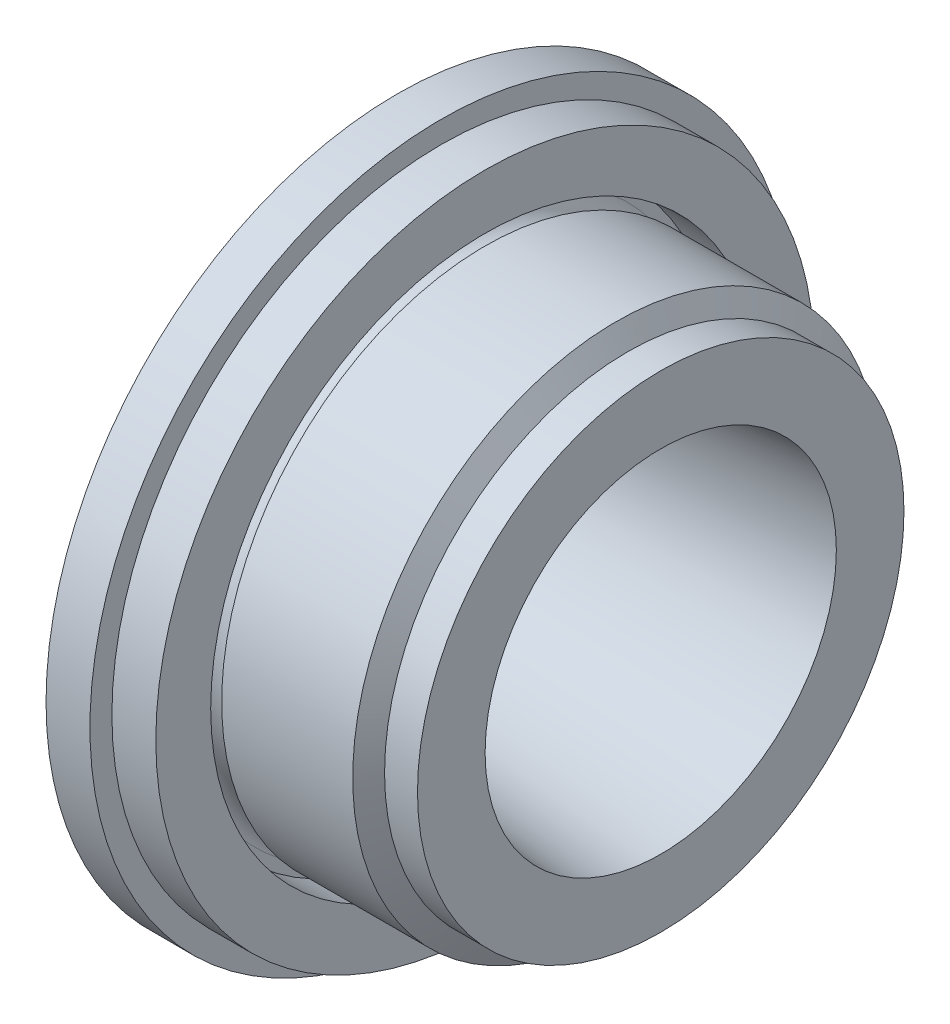
ISO-10303-21;
HEADER;
FILE_DESCRIPTION(('STEP AP214'),'2;1');
FILE_NAME('part.step','',(''),(''),'','','');
FILE_SCHEMA(('AUTOMOTIVE_DESIGN { 1 0 10303 214 1 1 1 1 }'));
ENDSEC;
DATA;
#1=APPLICATION_CONTEXT('core data for automotive mechanical design processes');
#2=APPLICATION_PROTOCOL_DEFINITION('international standard','automotive_design',2000,#1);
#3=PRODUCT_CONTEXT('',#1,'mechanical');
#4=PRODUCT('Part','Part','',(#3));
#5=PRODUCT_RELATED_PRODUCT_CATEGORY('part','',(#4));
#6=PRODUCT_DEFINITION_FORMATION('','',#4);
#7=PRODUCT_DEFINITION_CONTEXT('part definition',#1,'design');
#8=PRODUCT_DEFINITION('design','',#6,#7);
#9=PRODUCT_DEFINITION_SHAPE('','',#8);
#10=(LENGTH_UNIT() NAMED_UNIT(*) SI_UNIT(.MILLI.,.METRE.));
#11=(NAMED_UNIT(*) PLANE_ANGLE_UNIT() SI_UNIT($,.RADIAN.));
#12=(NAMED_UNIT(*) SI_UNIT($,.STERADIAN.) SOLID_ANGLE_UNIT());
#13=UNCERTAINTY_MEASURE_WITH_UNIT(LENGTH_MEASURE(1.E-05),#10,'distance_accuracy_value','');
#14=(GEOMETRIC_REPRESENTATION_CONTEXT(3) GLOBAL_UNCERTAINTY_ASSIGNED_CONTEXT((#13)) GLOBAL_UNIT_ASSIGNED_CONTEXT((#10,
#11,#12)) REPRESENTATION_CONTEXT('',''));
#15=CARTESIAN_POINT('',(0.,0.,0.));
#16=DIRECTION('',(0.,0.,1.));
#17=DIRECTION('',(1.,0.,0.));
#18=AXIS2_PLACEMENT_3D('',#15,#16,#17);
#19=CARTESIAN_POINT('',(6.,0.,-15.));
#20=DIRECTION('',(1.,0.,0.));
#21=DIRECTION('',(0.,0.,-1.));
#22=AXIS2_PLACEMENT_3D('',#19,#20,#21);
#23=PLANE('',#22);
#24=CARTESIAN_POINT('',(6.,0.,0.));
#25=DIRECTION('',(-1.,0.,0.));
#26=DIRECTION('',(0.,0.,1.));
#27=AXIS2_PLACEMENT_3D('',#24,#25,#26);
#28=CIRCLE('',#27,12.5);
#29=CARTESIAN_POINT('',(6.,0.,12.5));
#30=VERTEX_POINT('',#29);
#31=EDGE_CURVE('E11',#30,#30,#28,.T.);
#32=ORIENTED_EDGE('',*,*,#31,.F.);
#33=EDGE_LOOP('',(#32));
#34=FACE_BOUND('',#33,.T.);
#35=CARTESIAN_POINT('',(6.,0.,0.));
#36=DIRECTION('',(-1.,0.,0.));
#37=DIRECTION('',(0.,0.,1.));
#38=AXIS2_PLACEMENT_3D('',#35,#36,#37);
#39=CIRCLE('',#38,15.);
#40=CARTESIAN_POINT('',(6.,0.,15.));
#41=VERTEX_POINT('',#40);
#42=EDGE_CURVE('E48',#41,#41,#39,.T.);
#43=ORIENTED_EDGE('',*,*,#42,.T.);
#44=EDGE_LOOP('',(#43));
#45=FACE_BOUND('',#44,.T.);
#46=ADVANCED_FACE('F34',(#34,#45),#23,.F.);
#47=CARTESIAN_POINT('',(0.,0.,0.));
#48=DIRECTION('',(-1.,0.,0.));
#49=DIRECTION('',(0.,0.,1.));
#50=AXIS2_PLACEMENT_3D('',#47,#48,#49);
#51=CYLINDRICAL_SURFACE('',#50,12.5);
#52=CARTESIAN_POINT('',(8.,0.,0.));
#53=DIRECTION('',(-1.,0.,0.));
#54=DIRECTION('',(0.,0.,1.));
#55=AXIS2_PLACEMENT_3D('',#52,#53,#54);
#56=CIRCLE('',#55,12.5);
#57=CARTESIAN_POINT('',(8.,0.,12.5));
#58=VERTEX_POINT('',#57);
#59=EDGE_CURVE('E40',#58,#58,#56,.T.);
#60=ORIENTED_EDGE('',*,*,#59,.F.);
#61=EDGE_LOOP('',(#60));
#62=FACE_BOUND('',#61,.T.);
#63=ORIENTED_EDGE('',*,*,#31,.T.);
#64=EDGE_LOOP('',(#63));
#65=FACE_BOUND('',#64,.T.);
#66=ADVANCED_FACE('F63',(#62,#65),#51,.F.);
#67=CARTESIAN_POINT('',(8.,0.,-15.));
#68=DIRECTION('',(-1.,0.,0.));
#69=DIRECTION('',(0.,0.,1.));
#70=AXIS2_PLACEMENT_3D('',#67,#68,#69);
#71=PLANE('',#70);
#72=CARTESIAN_POINT('',(8.,0.,0.));
#73=DIRECTION('',(-1.,0.,0.));
#74=DIRECTION('',(0.,0.,1.));
#75=AXIS2_PLACEMENT_3D('',#72,#73,#74);
#76=CIRCLE('',#75,15.);
#77=CARTESIAN_POINT('',(8.,0.,15.));
#78=VERTEX_POINT('',#77);
#79=EDGE_CURVE('E44',#78,#78,#76,.T.);
#80=ORIENTED_EDGE('',*,*,#79,.F.);
#81=EDGE_LOOP('',(#80));
#82=FACE_BOUND('',#81,.T.);
#83=ORIENTED_EDGE('',*,*,#59,.T.);
#84=EDGE_LOOP('',(#83));
#85=FACE_BOUND('',#84,.T.);
#86=ADVANCED_FACE('F58',(#82,#85),#71,.F.);
#87=CARTESIAN_POINT('',(0.,0.,0.));
#88=DIRECTION('',(-1.,0.,0.));
#89=DIRECTION('',(0.,0.,1.));
#90=AXIS2_PLACEMENT_3D('',#87,#88,#89);
#91=CYLINDRICAL_SURFACE('',#90,15.);
#92=ORIENTED_EDGE('',*,*,#42,.F.);
#93=EDGE_LOOP('',(#92));
#94=FACE_BOUND('',#93,.T.);
#95=ORIENTED_EDGE('',*,*,#79,.T.);
#96=EDGE_LOOP('',(#95));
#97=FACE_BOUND('',#96,.T.);
#98=ADVANCED_FACE('F55',(#94,#97),#91,.T.);
#99=CLOSED_SHELL('',(#46,#66,#86,#98));
#100=MANIFOLD_SOLID_BREP('B2',#99);
#101=CARTESIAN_POINT('',(16.,0.,0.));
#102=DIRECTION('',(1.,0.,0.));
#103=DIRECTION('',(0.,0.,-1.));
#104=AXIS2_PLACEMENT_3D('',#101,#102,#103);
#105=PLANE('',#104);
#106=CARTESIAN_POINT('',(16.,0.,0.));
#107=DIRECTION('',(1.,0.,0.));
#108=DIRECTION('',(0.,0.,-1.));
#109=AXIS2_PLACEMENT_3D('',#106,#107,#108);
#110=CIRCLE('',#109,11.08);
#111=CARTESIAN_POINT('',(16.,0.,-11.08));
#112=VERTEX_POINT('',#111);
#113=EDGE_CURVE('E155',#112,#112,#110,.T.);
#114=ORIENTED_EDGE('',*,*,#113,.T.);
#115=EDGE_LOOP('',(#114));
#116=FACE_BOUND('',#115,.T.);
#117=CARTESIAN_POINT('',(16.,0.,0.));
#118=DIRECTION('',(-1.,0.,0.));
#119=DIRECTION('',(0.,0.,1.));
#120=AXIS2_PLACEMENT_3D('',#117,#118,#119);
#121=CIRCLE('',#120,8.);
#122=CARTESIAN_POINT('',(16.,0.,8.));
#123=VERTEX_POINT('',#122);
#124=EDGE_CURVE('E158',#123,#123,#121,.T.);
#125=ORIENTED_EDGE('',*,*,#124,.T.);
#126=EDGE_LOOP('',(#125));
#127=FACE_BOUND('',#126,.T.);
#128=ADVANCED_FACE('F87',(#116,#127),#105,.T.);
#129=CARTESIAN_POINT('',(34.,0.,0.));
#130=DIRECTION('',(1.,0.,0.));
#131=DIRECTION('',(0.,1.,0.));
#132=AXIS2_PLACEMENT_3D('',#129,#130,#131);
#133=SPHERICAL_SURFACE('',#132,34.);
#134=CARTESIAN_POINT('',(2.01507020641505,-11.4744888618782,-1.14033830860649));
#135=CARTESIAN_POINT('',(1.99316414672412,-11.4077588735427,-1.19735758739334));
#136=CARTESIAN_POINT('',(1.96970825341163,-11.3362388174347,-1.24831196884779));
#137=CARTESIAN_POINT('',(1.92048016703521,-11.1859530713964,-1.33682476388106));
#138=CARTESIAN_POINT('',(1.89470381541228,-11.1071743668495,-1.37435850265991));
#139=CARTESIAN_POINT('',(1.84168885318316,-10.9449392703155,-1.43509997596648));
#140=CARTESIAN_POINT('',(1.81445334267074,-10.8614927799586,-1.45833686807669));
#141=CARTESIAN_POINT('',(1.75924820555984,-10.6921278820859,-1.4901380193006));
#142=CARTESIAN_POINT('',(1.7312788151568,-10.6062102690526,-1.49870694181308));
#143=CARTESIAN_POINT('',(1.67464786898776,-10.4320205150327,-1.50105020049198));
#144=CARTESIAN_POINT('',(1.6459864321229,-10.3437430504542,-1.4944505669303));
#145=CARTESIAN_POINT('',(1.58947135037466,-10.169449125,-1.4657889744177));
#146=CARTESIAN_POINT('',(1.56161782035074,-10.0834329857764,-1.44372482800148));
#147=CARTESIAN_POINT('',(1.50750052075797,-9.91610527613574,-1.38453900604143));
#148=CARTESIAN_POINT('',(1.48123817117569,-9.83479791065408,-1.34740410220413));
#149=CARTESIAN_POINT('',(1.4311363835197,-9.679511944077,-1.25888152935647));
#150=CARTESIAN_POINT('',(1.40729660279525,-9.60553230657739,-1.20749587983161));
#151=CARTESIAN_POINT('',(1.36350935099579,-9.46952113327244,-1.09350135322107));
#152=CARTESIAN_POINT('',(1.34346524124899,-9.4071936943989,-1.03128317637637));
#153=CARTESIAN_POINT('',(1.30708300869549,-9.29397668622718,-0.896249543180997));
#154=CARTESIAN_POINT('',(1.29074378031333,-9.24308370480845,-0.823437258898824));
#155=CARTESIAN_POINT('',(1.26305967284416,-9.15680576970383,-0.673039667934089));
#156=CARTESIAN_POINT('',(1.25151265947189,-9.12079352966661,-0.595851401323272));
#157=CARTESIAN_POINT('',(1.23274851240983,-9.06225327582504,-0.436027808291888));
#158=CARTESIAN_POINT('',(1.22553014260356,-9.03972141247822,-0.35339404441248));
#159=CARTESIAN_POINT('',(1.21590948782587,-9.00968721390038,-0.188845454808264));
#160=CARTESIAN_POINT('',(1.2133141640563,-9.00158247376794,-0.107051432173872));
#161=CARTESIAN_POINT('',(1.21243549210383,-8.99883876111694,0.0567798437566473));
#162=CARTESIAN_POINT('',(1.2141515275461,-9.00419786373583,0.1388170606096));
#163=CARTESIAN_POINT('',(1.22176027493427,-9.02795306125547,0.299217272616773));
#164=CARTESIAN_POINT('',(1.22757520895538,-9.04610638081485,0.377620151869827));
#165=CARTESIAN_POINT('',(1.24309606573601,-9.09453830548877,0.530172329969996));
#166=CARTESIAN_POINT('',(1.25280208917137,-9.12481722433418,0.604321518702783));
#167=CARTESIAN_POINT('',(1.27593115170079,-9.1969263223258,0.747323174939155));
#168=CARTESIAN_POINT('',(1.28939926560413,-9.2388965609315,0.816097582656945));
#169=CARTESIAN_POINT('',(1.31957436581617,-9.33285749793261,0.945612282873689));
#170=CARTESIAN_POINT('',(1.33628184901572,-9.38484973360739,1.00635134041269));
#171=CARTESIAN_POINT('',(1.3731253934379,-9.49940021313811,1.12052674967403));
#172=CARTESIAN_POINT('',(1.39336607746915,-9.56228017705549,1.17360630349786));
#173=CARTESIAN_POINT('',(1.43622755030561,-9.69529442495459,1.26851444173011));
#174=CARTESIAN_POINT('',(1.45884886314649,-9.7654303060865,1.31034054173638));
#175=CARTESIAN_POINT('',(1.50698280562972,-9.91449708940522,1.38361989358052));
#176=CARTESIAN_POINT('',(1.53258152054097,-9.99368689895177,1.41449014179044));
#177=CARTESIAN_POINT('',(1.58503463339483,-10.155748016669,1.46240732578156));
#178=CARTESIAN_POINT('',(1.61188930312783,-10.238620121498,1.47945125475153));
#179=CARTESIAN_POINT('',(1.66720728831617,-10.4091099504116,1.49979635708825));
#180=CARTESIAN_POINT('',(1.69569266492921,-10.4967873075199,1.50254101264412));
#181=CARTESIAN_POINT('',(1.75248210115798,-10.671352191872,1.49274346620637));
#182=CARTESIAN_POINT('',(1.78078613654593,-10.758239614202,1.48019926268788));
#183=CARTESIAN_POINT('',(1.83679495459213,-10.9299540901275,1.43979915682445));
#184=CARTESIAN_POINT('',(1.86448658349882,-11.0147377991608,1.41173987282582));
#185=CARTESIAN_POINT('',(1.9180317556796,-11.1784776567508,1.34075660782236));
#186=CARTESIAN_POINT('',(1.94388539593273,-11.2574341127834,1.29783341179501));
#187=CARTESIAN_POINT('',(1.99242980040491,-11.40552516268,1.19907858800138));
#188=CARTESIAN_POINT('',(2.0151725083397,-11.4748215678508,1.14351566317585));
#189=CARTESIAN_POINT('',(2.05728735124629,-11.6030263276318,1.02040395786895));
#190=CARTESIAN_POINT('',(2.07666036227503,-11.6619373822891,0.952858301920954));
#191=CARTESIAN_POINT('',(2.11050961029609,-11.7647941509374,0.810941666006502));
#192=CARTESIAN_POINT('',(2.12516768547458,-11.8092961976159,0.737017533930746));
#193=CARTESIAN_POINT('',(2.15016786154167,-11.8851595256513,0.582038325305961));
#194=CARTESIAN_POINT('',(2.16051137446657,-11.9165251062221,0.500985592281611));
#195=CARTESIAN_POINT('',(2.17606039439396,-11.9636631313102,0.338379510187481));
#196=CARTESIAN_POINT('',(2.18149451350862,-11.9801294442802,0.257048764888463));
#197=CARTESIAN_POINT('',(2.18786185922502,-11.9994227369759,0.0926207952647989));
#198=CARTESIAN_POINT('',(2.18879622954999,-12.002253182597,0.00952402521342286));
#199=CARTESIAN_POINT('',(2.18616873628339,-11.994292458478,-0.153468505376185));
#200=CARTESIAN_POINT('',(2.18273881000132,-11.9839010011277,-0.233386337937641));
#201=CARTESIAN_POINT('',(2.17173680821688,-11.9505567648843,-0.390278331003294));
#202=CARTESIAN_POINT('',(2.16416371103616,-11.9276008876884,-0.467251760426128));
#203=CARTESIAN_POINT('',(2.14511570895706,-11.8698303503307,-0.616435743050083));
#204=CARTESIAN_POINT('',(2.13362521317678,-11.8349683037361,-0.688625866331445));
#205=CARTESIAN_POINT('',(2.10715441833109,-11.7545987929618,-0.826016755202184));
#206=CARTESIAN_POINT('',(2.09217806090607,-11.7091033522602,-0.891225294529247));
#207=CARTESIAN_POINT('',(2.06648254118589,-11.6309784666222,-0.986329580965032));
#208=CARTESIAN_POINT('',(2.05678770314318,-11.6014900152867,-1.01914336308444));
#209=CARTESIAN_POINT('',(2.0365472625915,-11.5398948467773,-1.08192086071025));
#210=CARTESIAN_POINT('',(2.02600170271548,-11.5077882608075,-1.11188471887353));
#211=CARTESIAN_POINT('',(2.01507020641505,-11.4744888618782,-1.14033830860649));
#212=B_SPLINE_CURVE_WITH_KNOTS('',3,(#134,#135,#136,#137,#138,#139,#140,#141,#142,#143,#144,
#145,#146,#147,#148,#149,#150,#151,#152,#153,#154,#155,#156,#157,#158,#159,#160,#161,#162,#163,
#164,#165,#166,#167,#168,#169,#170,#171,#172,#173,#174,#175,#176,#177,#178,#179,#180,#181,#182,
#183,#184,#185,#186,#187,#188,#189,#190,#191,#192,#193,#194,#195,#196,#197,#198,#199,#200,#201,
#202,#203,#204,#205,#206,#207,#208,#209,#210,#211),.UNSPECIFIED.,.T.,.F.,(4,2,2,2,2,2,2,2,2,2,2,
2,2,2,2,2,2,2,2,2,2,2,2,2,2,2,2,2,2,2,2,2,2,2,2,2,2,2,4),(0.,0.271223910224331,
0.542943951283895,0.814107982232351,1.0851857857699,1.36301826548178,1.64089005270976,
1.91900627005612,2.19708309543378,2.4666671465599,2.73617064479393,2.99273395473107,
3.24922396379614,3.49472805811123,3.74019705585271,3.98112938711453,4.22206795252552,
4.46602717454562,4.71002384741915,4.96311956163326,5.21627110551166,5.48137534991165,
5.7465372311187,6.02194585310496,6.29739053379383,6.57653458502902,6.85566389664616,
7.12933742149125,7.40293968974668,7.66416784192503,7.92531043418654,8.17355026566697,
8.42172699747941,8.66257628235641,8.9034849858497,9.14536389850817,9.38697062383999,
9.52232274603785,9.6576680894285),.UNSPECIFIED.);
#213=CARTESIAN_POINT('',(2.01507020641505,-11.4744888618782,-1.14033830860649));
#214=VERTEX_POINT('',#213);
#215=EDGE_CURVE('E399',#214,#214,#212,.T.);
#216=ORIENTED_EDGE('',*,*,#215,.T.);
#217=EDGE_LOOP('',(#216));
#218=FACE_BOUND('',#217,.T.);
#219=CARTESIAN_POINT('',(1.36083636006388,9.46119015460793,-1.08206943347672));
#220=CARTESIAN_POINT('',(1.3810984773071,9.52417462947835,-1.14252987997486));
#221=CARTESIAN_POINT('',(1.40301325631112,9.59223770301531,-1.1972725119639));
#222=CARTESIAN_POINT('',(1.44943666918713,9.7362556159751,-1.29392508931421));
#223=CARTESIAN_POINT('',(1.47394996727159,9.81222464156813,-1.33581141497906));
#224=CARTESIAN_POINT('',(1.52476861338737,9.96952330728536,-1.40569583357822));
#225=CARTESIAN_POINT('',(1.55106987129119,10.0508406995211,-1.4337244868263));
#226=CARTESIAN_POINT('',(1.60477532468505,10.2166732946206,-1.47547888350461));
#227=CARTESIAN_POINT('',(1.63217918235043,10.3011875175418,-1.48920897371831));
#228=CARTESIAN_POINT('',(1.68817508299864,10.4736560119661,-1.50233085086911));
#229=CARTESIAN_POINT('',(1.71677858732457,10.5616391530565,-1.50129720564139));
#230=CARTESIAN_POINT('',(1.77360862255496,10.7362146012172,-1.48388003225434));
#231=CARTESIAN_POINT('',(1.80183508329915,10.8228066500241,-1.4674936865352));
#232=CARTESIAN_POINT('',(1.85737119940296,10.9929615380639,-1.4194636995231));
#233=CARTESIAN_POINT('',(1.88466948516253,11.076487422966,-1.38767543739243));
#234=CARTESIAN_POINT('',(1.9372213640151,11.2370912872771,-1.30945469896047));
#235=CARTESIAN_POINT('',(1.96247512875434,11.3141698079879,-1.2630234536056));
#236=CARTESIAN_POINT('',(2.00953531720002,11.4576529046329,-1.15785422277268));
#237=CARTESIAN_POINT('',(2.03140872477502,11.5242654950709,-1.09943056037841));
#238=CARTESIAN_POINT('',(2.07162774060155,11.6466404828142,-0.971117009413804));
#239=CARTESIAN_POINT('',(2.08997434996072,11.7024059592063,-0.90123038515944));
#240=CARTESIAN_POINT('',(2.12166093531421,11.7986542193265,-0.755487914789521));
#241=CARTESIAN_POINT('',(2.13519606980851,11.8397332490493,-0.680068433783711));
#242=CARTESIAN_POINT('',(2.1578878172834,11.9085724511499,-0.522768123064322));
#243=CARTESIAN_POINT('',(2.16704584119816,11.936336915404,-0.440889385380121));
#244=CARTESIAN_POINT('',(2.18027741245386,11.9764426823801,-0.277255421036722));
#245=CARTESIAN_POINT('',(2.18457453159588,11.9894621993814,-0.195684051755538));
#246=CARTESIAN_POINT('',(2.18868971834056,12.0019306057637,-0.0314042275716611));
#247=CARTESIAN_POINT('',(2.18850862244094,12.0013820295649,0.0513040120872796));
#248=CARTESIAN_POINT('',(2.18373896348807,11.9869304171164,0.213258018799255));
#249=CARTESIAN_POINT('',(2.1792637955317,11.9733709636632,0.292538142793871));
#250=CARTESIAN_POINT('',(2.16624028398176,11.9338944916858,0.447602095366547));
#251=CARTESIAN_POINT('',(2.15769194097782,11.9079774749505,0.52338592445073));
#252=CARTESIAN_POINT('',(2.13674885173378,11.8444445746343,0.670001376412721));
#253=CARTESIAN_POINT('',(2.12432499311531,11.8067401406048,0.740790370941885));
#254=CARTESIAN_POINT('',(2.09607699257292,11.7209474103893,0.875005298506328));
#255=CARTESIAN_POINT('',(2.08025235584622,11.6728576031583,0.938430158011947));
#256=CARTESIAN_POINT('',(2.04507234428883,11.5658532460811,1.05861312179294));
#257=CARTESIAN_POINT('',(2.02560991747831,11.5066099317189,1.11504688598817));
#258=CARTESIAN_POINT('',(1.98416281754132,11.3803142249817,1.21723037641903));
#259=CARTESIAN_POINT('',(1.96217757898213,11.3132600819302,1.26297770052235));
#260=CARTESIAN_POINT('',(1.91517507514941,11.1697422638733,1.34484120035808));
#261=CARTESIAN_POINT('',(1.89006211403479,11.0929787998746,1.38037700456866));
#262=CARTESIAN_POINT('',(1.83844474609912,10.9350014281263,1.43800136830224));
#263=CARTESIAN_POINT('',(1.81194002473098,10.8537865141361,1.46008687363586));
#264=CARTESIAN_POINT('',(1.7571215418628,10.6855985756565,1.49102743634829));
#265=CARTESIAN_POINT('',(1.72877838078843,10.5985265320259,1.4992943256354));
#266=CARTESIAN_POINT('',(1.67212368085382,10.4242483621288,1.50061922392167));
#267=CARTESIAN_POINT('',(1.64381214710328,10.3370422184466,1.49367505477365));
#268=CARTESIAN_POINT('',(1.58753070302913,10.1634590009846,1.46444986331096));
#269=CARTESIAN_POINT('',(1.55957436243578,10.077120002948,1.44191501834142));
#270=CARTESIAN_POINT('',(1.50531279744085,9.90933524578387,1.38168676613277));
#271=CARTESIAN_POINT('',(1.47900751743969,9.82788932188581,1.34399386965904));
#272=CARTESIAN_POINT('',(1.42926512464757,9.67370662332442,1.25500351097317));
#273=CARTESIAN_POINT('',(1.40578863524727,9.60085068962677,1.20393498249821));
#274=CARTESIAN_POINT('',(1.36198477589238,9.46478298355085,1.08914742251373));
#275=CARTESIAN_POINT('',(1.34165667628118,9.40156897665484,1.02543132998014));
#276=CARTESIAN_POINT('',(1.30564375819175,9.28949435666666,0.889986528198904));
#277=CARTESIAN_POINT('',(1.28979963516451,9.24014196230695,0.818707406850016));
#278=CARTESIAN_POINT('',(1.26222746676063,9.15421145563431,0.668103237953574));
#279=CARTESIAN_POINT('',(1.25049813809931,9.11762936065397,0.588780708877023));
#280=CARTESIAN_POINT('',(1.2320592311729,9.06010186056285,0.428478529219913));
#281=CARTESIAN_POINT('',(1.22513477705668,9.03848721439003,0.34776345347249));
#282=CARTESIAN_POINT('',(1.21567332001801,9.00894985864909,0.183623566282876));
#283=CARTESIAN_POINT('',(1.21313514403161,9.00102348829602,0.10019948541804));
#284=CARTESIAN_POINT('',(1.21254871455141,8.99919228793276,-0.0641214893075309));
#285=CARTESIAN_POINT('',(1.21435866373953,9.00484464021696,-0.145013357417286));
#286=CARTESIAN_POINT('',(1.22211087575694,9.02904758738679,-0.304658391833473));
#287=CARTESIAN_POINT('',(1.22805403647299,9.0476009848575,-0.38341108956958));
#288=CARTESIAN_POINT('',(1.24384860778672,9.09688608510884,-0.536396452670373));
#289=CARTESIAN_POINT('',(1.25369213409666,9.12759321990966,-0.610637890149659));
#290=CARTESIAN_POINT('',(1.27695678041793,9.2001226970077,-0.752776134003903));
#291=CARTESIAN_POINT('',(1.2903736890324,9.24193195476649,-0.820680282768725));
#292=CARTESIAN_POINT('',(1.31368653598303,9.31452293042625,-0.920099543637189));
#293=CARTESIAN_POINT('',(1.32249824824813,9.34195073991689,-0.954377679937603));
#294=CARTESIAN_POINT('',(1.34101479112699,9.39956048991834,-1.02026873778506));
#295=CARTESIAN_POINT('',(1.35071957455212,9.4297422849117,-1.05188179998194));
#296=CARTESIAN_POINT('',(1.36083636006388,9.46119015460793,-1.08206943347672));
#297=B_SPLINE_CURVE_WITH_KNOTS('',3,(#219,#220,#221,#222,#223,#224,#225,#226,#227,#228,#229,
#230,#231,#232,#233,#234,#235,#236,#237,#238,#239,#240,#241,#242,#243,#244,#245,#246,#247,#248,
#249,#250,#251,#252,#253,#254,#255,#256,#257,#258,#259,#260,#261,#262,#263,#264,#265,#266,#267,
#268,#269,#270,#271,#272,#273,#274,#275,#276,#277,#278,#279,#280,#281,#282,#283,#284,#285,#286,
#287,#288,#289,#290,#291,#292,#293,#294,#295,#296),.UNSPECIFIED.,.T.,.F.,(4,2,2,2,2,2,2,2,2,2,2,
2,2,2,2,2,2,2,2,2,2,2,2,2,2,2,2,2,2,2,2,2,2,2,2,2,2,2,4),(0.,0.268711004808278,
0.537912772478925,0.806518191791236,1.0750419308166,1.35131868908255,1.6276461601726,
1.90662010555136,2.1855706055379,2.45797591537042,2.73030378639788,2.98980116252931,
3.24921483479956,3.49613857683486,3.74301619567494,3.98354885966106,4.22408148882759,
4.4664663425697,4.70888648647056,4.96007985088309,5.21132962512946,5.47486581450263,
5.73846182333596,6.01301574890895,6.2876089917953,6.56678128594516,6.84594417389952,
7.12061009309808,7.39521226140322,7.65826752329556,7.9212406728172,8.17152675414071,
8.42174588872074,8.66391643998134,8.90613961610223,9.1478756344532,9.38932800679816,
9.52350130834063,9.65766752442072),.UNSPECIFIED.);
#298=CARTESIAN_POINT('',(1.36083636006388,9.46119015460793,-1.08206943347672));
#299=VERTEX_POINT('',#298);
#300=EDGE_CURVE('E162',#299,#299,#297,.T.);
#301=ORIENTED_EDGE('',*,*,#300,.T.);
#302=EDGE_LOOP('',(#301));
#303=FACE_BOUND('',#302,.T.);
#304=CARTESIAN_POINT('',(4.,0.,0.));
#305=DIRECTION('',(1.,0.,0.));
#306=DIRECTION('',(0.,0.,-1.));
#307=AXIS2_PLACEMENT_3D('',#304,#305,#306);
#308=CIRCLE('',#307,16.);
#309=CARTESIAN_POINT('',(4.,0.,-16.));
#310=VERTEX_POINT('',#309);
#311=EDGE_CURVE('E137',#310,#310,#308,.T.);
#312=ORIENTED_EDGE('',*,*,#311,.F.);
#313=EDGE_LOOP('',(#312));
#314=FACE_BOUND('',#313,.T.);
#315=ADVANCED_FACE('F89',(#218,#303,#314),#133,.T.);
#316=CARTESIAN_POINT('',(0.,0.,0.));
#317=DIRECTION('',(1.,0.,0.));
#318=DIRECTION('',(0.,0.,-1.));
#319=AXIS2_PLACEMENT_3D('',#316,#317,#318);
#320=CYLINDRICAL_SURFACE('',#319,16.);
#321=ORIENTED_EDGE('',*,*,#311,.T.);
#322=EDGE_LOOP('',(#321));
#323=FACE_BOUND('',#322,.T.);
#324=CARTESIAN_POINT('',(6.,0.,0.));
#325=DIRECTION('',(1.,0.,0.));
#326=DIRECTION('',(0.,0.,-1.));
#327=AXIS2_PLACEMENT_3D('',#324,#325,#326);
#328=CIRCLE('',#327,16.);
#329=CARTESIAN_POINT('',(6.,0.,-16.));
#330=VERTEX_POINT('',#329);
#331=EDGE_CURVE('E140',#330,#330,#328,.T.);
#332=ORIENTED_EDGE('',*,*,#331,.F.);
#333=EDGE_LOOP('',(#332));
#334=FACE_BOUND('',#333,.T.);
#335=ADVANCED_FACE('F200',(#323,#334),#320,.T.);
#336=CARTESIAN_POINT('',(6.,12.,0.));
#337=DIRECTION('',(1.,0.,0.));
#338=DIRECTION('',(0.,0.,-1.));
#339=AXIS2_PLACEMENT_3D('',#336,#337,#338);
#340=PLANE('',#339);
#341=ORIENTED_EDGE('',*,*,#331,.T.);
#342=EDGE_LOOP('',(#341));
#343=FACE_BOUND('',#342,.T.);
#344=CARTESIAN_POINT('',(6.,0.,0.));
#345=DIRECTION('',(1.,0.,0.));
#346=DIRECTION('',(0.,0.,-1.));
#347=AXIS2_PLACEMENT_3D('',#344,#345,#346);
#348=CIRCLE('',#347,12.);
#349=CARTESIAN_POINT('',(6.,0.,-12.));
#350=VERTEX_POINT('',#349);
#351=EDGE_CURVE('E143',#350,#350,#348,.T.);
#352=ORIENTED_EDGE('',*,*,#351,.F.);
#353=EDGE_LOOP('',(#352));
#354=FACE_BOUND('',#353,.T.);
#355=ADVANCED_FACE('F221',(#343,#354),#340,.T.);
#356=CARTESIAN_POINT('',(7.,0.,0.));
#357=DIRECTION('',(1.,0.,0.));
#358=DIRECTION('',(0.,0.,-1.));
#359=AXIS2_PLACEMENT_3D('',#356,#357,#358);
#360=TOROIDAL_SURFACE('',#359,12.,1.);
#361=ORIENTED_EDGE('',*,*,#351,.T.);
#362=EDGE_LOOP('',(#361));
#363=FACE_BOUND('',#362,.T.);
#364=CARTESIAN_POINT('',(8.,0.,0.));
#365=DIRECTION('',(1.,0.,0.));
#366=DIRECTION('',(0.,0.,-1.));
#367=AXIS2_PLACEMENT_3D('',#364,#365,#366);
#368=CIRCLE('',#367,12.);
#369=CARTESIAN_POINT('',(8.,0.,-12.));
#370=VERTEX_POINT('',#369);
#371=EDGE_CURVE('E146',#370,#370,#368,.T.);
#372=ORIENTED_EDGE('',*,*,#371,.F.);
#373=EDGE_LOOP('',(#372));
#374=FACE_BOUND('',#373,.T.);
#375=ADVANCED_FACE('F217',(#363,#374),#360,.F.);
#376=CARTESIAN_POINT('',(0.,0.,0.));
#377=DIRECTION('',(1.,0.,0.));
#378=DIRECTION('',(0.,0.,-1.));
#379=AXIS2_PLACEMENT_3D('',#376,#377,#378);
#380=CYLINDRICAL_SURFACE('',#379,12.);
#381=ORIENTED_EDGE('',*,*,#371,.T.);
#382=EDGE_LOOP('',(#381));
#383=FACE_BOUND('',#382,.T.);
#384=CARTESIAN_POINT('',(13.9688377523455,0.,0.));
#385=DIRECTION('',(1.,0.,0.));
#386=DIRECTION('',(0.,0.,-1.));
#387=AXIS2_PLACEMENT_3D('',#384,#385,#386);
#388=CIRCLE('',#387,12.);
#389=CARTESIAN_POINT('',(13.9688377523455,0.,-12.));
#390=VERTEX_POINT('',#389);
#391=EDGE_CURVE('E149',#390,#390,#388,.T.);
#392=ORIENTED_EDGE('',*,*,#391,.F.);
#393=EDGE_LOOP('',(#392));
#394=FACE_BOUND('',#393,.T.);
#395=ADVANCED_FACE('F213',(#383,#394),#380,.T.);
#396=CARTESIAN_POINT('',(14.5,0.,0.));
#397=DIRECTION('',(-1.,0.,0.));
#398=DIRECTION('',(0.,0.,1.));
#399=AXIS2_PLACEMENT_3D('',#396,#397,#398);
#400=CONICAL_SURFACE('',#399,11.08,1.0471975511966);
#401=ORIENTED_EDGE('',*,*,#391,.T.);
#402=EDGE_LOOP('',(#401));
#403=FACE_BOUND('',#402,.T.);
#404=CARTESIAN_POINT('',(14.5,0.,0.));
#405=DIRECTION('',(1.,0.,0.));
#406=DIRECTION('',(0.,0.,-1.));
#407=AXIS2_PLACEMENT_3D('',#404,#405,#406);
#408=CIRCLE('',#407,11.08);
#409=CARTESIAN_POINT('',(14.5,0.,-11.08));
#410=VERTEX_POINT('',#409);
#411=EDGE_CURVE('E152',#410,#410,#408,.T.);
#412=ORIENTED_EDGE('',*,*,#411,.F.);
#413=EDGE_LOOP('',(#412));
#414=FACE_BOUND('',#413,.T.);
#415=ADVANCED_FACE('F209',(#403,#414),#400,.T.);
#416=CARTESIAN_POINT('',(0.,0.,0.));
#417=DIRECTION('',(1.,0.,0.));
#418=DIRECTION('',(0.,0.,-1.));
#419=AXIS2_PLACEMENT_3D('',#416,#417,#418);
#420=CYLINDRICAL_SURFACE('',#419,11.08);
#421=ORIENTED_EDGE('',*,*,#411,.T.);
#422=EDGE_LOOP('',(#421));
#423=FACE_BOUND('',#422,.T.);
#424=ORIENTED_EDGE('',*,*,#113,.F.);
#425=EDGE_LOOP('',(#424));
#426=FACE_BOUND('',#425,.T.);
#427=ADVANCED_FACE('F207',(#423,#426),#420,.T.);
#428=CARTESIAN_POINT('',(16.,0.,0.));
#429=DIRECTION('',(1.,0.,0.));
#430=DIRECTION('',(0.,0.,-1.));
#431=AXIS2_PLACEMENT_3D('',#428,#429,#430);
#432=CONICAL_SURFACE('',#431,8.,0.0872664625997099);
#433=CARTESIAN_POINT('',(3.6197731030192,0.,0.));
#434=DIRECTION('',(1.,0.,0.));
#435=DIRECTION('',(0.,0.,-1.));
#436=AXIS2_PLACEMENT_3D('',#433,#434,#435);
#437=CIRCLE('',#436,6.91687049463554);
#438=CARTESIAN_POINT('',(3.6197731030192,0.,-6.91687049463554));
#439=VERTEX_POINT('',#438);
#440=EDGE_CURVE('E134',#439,#439,#437,.F.);
#441=ORIENTED_EDGE('',*,*,#440,.T.);
#442=EDGE_LOOP('',(#441));
#443=FACE_BOUND('',#442,.T.);
#444=ORIENTED_EDGE('',*,*,#124,.F.);
#445=EDGE_LOOP('',(#444));
#446=FACE_BOUND('',#445,.T.);
#447=ADVANCED_FACE('F205',(#443,#446),#432,.F.);
#448=CARTESIAN_POINT('',(2.9760106413114,0.,0.));
#449=DIRECTION('',(-1.,0.,0.));
#450=DIRECTION('',(0.,0.,1.));
#451=AXIS2_PLACEMENT_3D('',#448,#449,#450);
#452=CONICAL_SURFACE('',#451,6.86054857723256,0.513016709734461);
#453=CARTESIAN_POINT('',(3.53904268388764,0.,0.));
#454=DIRECTION('',(-1.,0.,0.));
#455=DIRECTION('',(0.,0.,1.));
#456=AXIS2_PLACEMENT_3D('',#453,#454,#455);
#457=CIRCLE('',#456,6.54337798509568);
#458=CARTESIAN_POINT('',(3.53904268388764,0.,6.54337798509568));
#459=VERTEX_POINT('',#458);
#460=EDGE_CURVE('E128',#459,#459,#457,.F.);
#461=ORIENTED_EDGE('',*,*,#460,.T.);
#462=EDGE_LOOP('',(#461));
#463=FACE_BOUND('',#462,.T.);
#464=CARTESIAN_POINT('',(5.12006499663375,0.,0.));
#465=DIRECTION('',(1.,0.,0.));
#466=DIRECTION('',(0.,0.,-1.));
#467=AXIS2_PLACEMENT_3D('',#464,#465,#466);
#468=CIRCLE('',#467,5.65274699929807);
#469=CARTESIAN_POINT('',(5.12006499663375,0.,-5.65274699929807));
#470=VERTEX_POINT('',#469);
#471=EDGE_CURVE('E131',#470,#470,#468,.F.);
#472=ORIENTED_EDGE('',*,*,#471,.T.);
#473=EDGE_LOOP('',(#472));
#474=FACE_BOUND('',#473,.T.);
#475=ADVANCED_FACE('F272',(#463,#474),#452,.T.);
#476=CARTESIAN_POINT('',(5.67108735789829,0.,0.));
#477=DIRECTION('',(1.,0.,0.));
#478=DIRECTION('',(0.,0.,-1.));
#479=AXIS2_PLACEMENT_3D('',#476,#477,#478);
#480=CONICAL_SURFACE('',#479,5.34234177297514,0.0995545254785599);
#481=CARTESIAN_POINT('',(3.22242802029143,0.,0.));
#482=DIRECTION('',(1.,0.,0.));
#483=DIRECTION('',(0.,0.,-1.));
#484=AXIS2_PLACEMENT_3D('',#481,#482,#483);
#485=CIRCLE('',#484,5.09775808875129);
#486=CARTESIAN_POINT('',(3.22242802029143,0.,-5.09775808875129));
#487=VERTEX_POINT('',#486);
#488=EDGE_CURVE('E122',#487,#487,#485,.F.);
#489=ORIENTED_EDGE('',*,*,#488,.T.);
#490=EDGE_LOOP('',(#489));
#491=FACE_BOUND('',#490,.T.);
#492=CARTESIAN_POINT('',(5.04178146050292,0.,0.));
#493=DIRECTION('',(-1.,0.,0.));
#494=DIRECTION('',(0.,0.,1.));
#495=AXIS2_PLACEMENT_3D('',#492,#493,#494);
#496=CIRCLE('',#495,5.27948372141817);
#497=CARTESIAN_POINT('',(5.04178146050292,0.,5.27948372141817));
#498=VERTEX_POINT('',#497);
#499=EDGE_CURVE('E125',#498,#498,#496,.F.);
#500=ORIENTED_EDGE('',*,*,#499,.T.);
#501=EDGE_LOOP('',(#500));
#502=FACE_BOUND('',#501,.T.);
#503=ADVANCED_FACE('F279',(#491,#502),#480,.F.);
#504=CARTESIAN_POINT('',(2.59312212289605,0.,0.));
#505=DIRECTION('',(-1.,0.,0.));
#506=DIRECTION('',(0.,0.,1.));
#507=AXIS2_PLACEMENT_3D('',#504,#505,#506);
#508=CONICAL_SURFACE('',#507,5.03490003719431,0.513016709734462);
#509=CARTESIAN_POINT('',(3.14414448416059,0.,0.));
#510=DIRECTION('',(-1.,0.,0.));
#511=DIRECTION('',(0.,0.,1.));
#512=AXIS2_PLACEMENT_3D('',#509,#510,#511);
#513=CIRCLE('',#512,4.72449481087138);
#514=CARTESIAN_POINT('',(3.14414448416059,0.,4.72449481087138));
#515=VERTEX_POINT('',#514);
#516=EDGE_CURVE('E116',#515,#515,#513,.F.);
#517=ORIENTED_EDGE('',*,*,#516,.T.);
#518=EDGE_LOOP('',(#517));
#519=FACE_BOUND('',#518,.T.);
#520=CARTESIAN_POINT('',(4.7371764782184,0.,0.));
#521=DIRECTION('',(1.,0.,0.));
#522=DIRECTION('',(0.,0.,-1.));
#523=AXIS2_PLACEMENT_3D('',#520,#521,#522);
#524=CIRCLE('',#523,3.82709845925982);
#525=CARTESIAN_POINT('',(4.7371764782184,0.,-3.82709845925982));
#526=VERTEX_POINT('',#525);
#527=EDGE_CURVE('E119',#526,#526,#524,.F.);
#528=ORIENTED_EDGE('',*,*,#527,.T.);
#529=EDGE_LOOP('',(#528));
#530=FACE_BOUND('',#529,.T.);
#531=ADVANCED_FACE('F286',(#519,#530),#508,.T.);
#532=CARTESIAN_POINT('',(5.28819883948294,0.,0.));
#533=DIRECTION('',(1.,0.,0.));
#534=DIRECTION('',(0.,0.,-1.));
#535=AXIS2_PLACEMENT_3D('',#532,#533,#534);
#536=CONICAL_SURFACE('',#535,3.51669323293688,0.0995545254785599);
#537=CARTESIAN_POINT('',(3.05871067052974,0.,0.));
#538=DIRECTION('',(1.,0.,0.));
#539=DIRECTION('',(0.,0.,-1.));
#540=AXIS2_PLACEMENT_3D('',#537,#538,#539);
#541=CIRCLE('',#540,3.29400140238237);
#542=CARTESIAN_POINT('',(3.05871067052974,0.,-3.29400140238237));
#543=VERTEX_POINT('',#542);
#544=EDGE_CURVE('E110',#543,#543,#541,.F.);
#545=ORIENTED_EDGE('',*,*,#544,.T.);
#546=EDGE_LOOP('',(#545));
#547=FACE_BOUND('',#546,.T.);
#548=CARTESIAN_POINT('',(4.65889294208757,0.,0.));
#549=DIRECTION('',(-1.,0.,0.));
#550=DIRECTION('',(0.,0.,1.));
#551=AXIS2_PLACEMENT_3D('',#548,#549,#550);
#552=CIRCLE('',#551,3.45383518137991);
#553=CARTESIAN_POINT('',(4.65889294208757,0.,3.45383518137991));
#554=VERTEX_POINT('',#553);
#555=EDGE_CURVE('E113',#554,#554,#552,.F.);
#556=ORIENTED_EDGE('',*,*,#555,.T.);
#557=EDGE_LOOP('',(#556));
#558=FACE_BOUND('',#557,.T.);
#559=ADVANCED_FACE('F294',(#547,#558),#536,.F.);
#560=CARTESIAN_POINT('',(2.21023360448071,0.,0.));
#561=DIRECTION('',(-1.,0.,0.));
#562=DIRECTION('',(0.,0.,1.));
#563=AXIS2_PLACEMENT_3D('',#560,#561,#562);
#564=CONICAL_SURFACE('',#563,3.20925149715605,0.361215097746523);
#565=CARTESIAN_POINT('',(3.00790646626862,0.,0.));
#566=DIRECTION('',(-1.,0.,0.));
#567=DIRECTION('',(0.,0.,1.));
#568=AXIS2_PLACEMENT_3D('',#565,#566,#567);
#569=CIRCLE('',#568,2.90789807737436);
#570=CARTESIAN_POINT('',(3.00790646626862,0.,2.90789807737436));
#571=VERTEX_POINT('',#570);
#572=EDGE_CURVE('E102',#571,#571,#569,.F.);
#573=ORIENTED_EDGE('',*,*,#572,.T.);
#574=EDGE_LOOP('',(#573));
#575=FACE_BOUND('',#574,.T.);
#576=CARTESIAN_POINT('',(4.40925079583526,0.,0.));
#577=DIRECTION('',(1.,0.,0.));
#578=DIRECTION('',(0.,0.,-1.));
#579=AXIS2_PLACEMENT_3D('',#576,#577,#578);
#580=CIRCLE('',#579,2.37848316778344);
#581=CARTESIAN_POINT('',(4.40925079583526,0.,-2.37848316778344));
#582=VERTEX_POINT('',#581);
#583=EDGE_CURVE('E107',#582,#582,#580,.F.);
#584=ORIENTED_EDGE('',*,*,#583,.T.);
#585=EDGE_LOOP('',(#584));
#586=FACE_BOUND('',#585,.T.);
#587=ADVANCED_FACE('F302',(#575,#586),#564,.T.);
#588=CARTESIAN_POINT('',(5.10389972196428,0.,0.));
#589=DIRECTION('',(1.,0.,0.));
#590=DIRECTION('',(0.,0.,-1.));
#591=AXIS2_PLACEMENT_3D('',#588,#589,#590);
#592=CONICAL_SURFACE('',#591,2.1160512367692,0.16496966854556);
#593=CARTESIAN_POINT('',(2.2095012726277,0.,0.));
#594=DIRECTION('',(1.,0.,0.));
#595=DIRECTION('',(0.,0.,-1.));
#596=AXIS2_PLACEMENT_3D('',#593,#594,#595);
#597=CIRCLE('',#596,1.63418399463018);
#598=CARTESIAN_POINT('',(2.2095012726277,0.,-1.63418399463018));
#599=VERTEX_POINT('',#598);
#600=EDGE_CURVE('E94',#599,#599,#597,.F.);
#601=ORIENTED_EDGE('',*,*,#600,.T.);
#602=EDGE_LOOP('',(#601));
#603=FACE_BOUND('',#602,.T.);
#604=CARTESIAN_POINT('',(4.37141304230619,0.,0.));
#605=DIRECTION('',(-1.,0.,0.));
#606=DIRECTION('',(0.,0.,1.));
#607=AXIS2_PLACEMENT_3D('',#604,#605,#606);
#608=CIRCLE('',#607,1.99410488335289);
#609=CARTESIAN_POINT('',(4.37141304230619,0.,1.99410488335289));
#610=VERTEX_POINT('',#609);
#611=EDGE_CURVE('E98',#610,#610,#608,.F.);
#612=ORIENTED_EDGE('',*,*,#611,.T.);
#613=EDGE_LOOP('',(#612));
#614=FACE_BOUND('',#613,.T.);
#615=ADVANCED_FACE('F310',(#603,#614),#592,.F.);
#616=CARTESIAN_POINT('',(26.6,0.,0.));
#617=DIRECTION('',(-1.,0.,0.));
#618=DIRECTION('',(0.,0.,-1.));
#619=AXIS2_PLACEMENT_3D('',#616,#617,#618);
#620=SPHERICAL_SURFACE('',#619,24.6);
#621=CARTESIAN_POINT('',(2.04269285126173,0.,0.));
#622=DIRECTION('',(1.,0.,0.));
#623=DIRECTION('',(0.,0.,-1.));
#624=AXIS2_PLACEMENT_3D('',#621,#622,#623);
#625=CIRCLE('',#624,1.44867719058735);
#626=CARTESIAN_POINT('',(2.04269285126173,0.,-1.44867719058735));
#627=VERTEX_POINT('',#626);
#628=EDGE_CURVE('E33',#627,#627,#625,.T.);
#629=ORIENTED_EDGE('',*,*,#628,.T.);
#630=EDGE_LOOP('',(#629));
#631=FACE_BOUND('',#630,.T.);
#632=ADVANCED_FACE('F318',(#631),#620,.F.);
#633=CARTESIAN_POINT('',(3.63720425156873,0.,0.));
#634=DIRECTION('',(-1.,0.,0.));
#635=DIRECTION('',(0.,0.,1.));
#636=AXIS2_PLACEMENT_3D('',#633,#634,#635);
#637=TOROIDAL_SURFACE('',#636,6.71763155501719,0.2);
#638=ORIENTED_EDGE('',*,*,#460,.F.);
#639=EDGE_LOOP('',(#638));
#640=FACE_BOUND('',#639,.T.);
#641=ORIENTED_EDGE('',*,*,#440,.F.);
#642=EDGE_LOOP('',(#641));
#643=FACE_BOUND('',#642,.T.);
#644=ADVANCED_FACE('F325',(#640,#643),#637,.F.);
#645=CARTESIAN_POINT('',(3.24230605184169,0.,0.));
#646=DIRECTION('',(-1.,0.,0.));
#647=DIRECTION('',(0.,0.,1.));
#648=AXIS2_PLACEMENT_3D('',#645,#646,#647);
#649=TOROIDAL_SURFACE('',#648,4.89874838079289,0.2);
#650=ORIENTED_EDGE('',*,*,#516,.F.);
#651=EDGE_LOOP('',(#650));
#652=FACE_BOUND('',#651,.T.);
#653=ORIENTED_EDGE('',*,*,#488,.F.);
#654=EDGE_LOOP('',(#653));
#655=FACE_BOUND('',#654,.T.);
#656=ADVANCED_FACE('F332',(#652,#655),#649,.F.);
#657=CARTESIAN_POINT('',(3.07858870207999,0.,0.));
#658=DIRECTION('',(-1.,0.,0.));
#659=DIRECTION('',(0.,0.,1.));
#660=AXIS2_PLACEMENT_3D('',#657,#658,#659);
#661=TOROIDAL_SURFACE('',#660,3.09499169442397,0.2);
#662=ORIENTED_EDGE('',*,*,#572,.F.);
#663=EDGE_LOOP('',(#662));
#664=FACE_BOUND('',#663,.T.);
#665=ORIENTED_EDGE('',*,*,#544,.F.);
#666=EDGE_LOOP('',(#665));
#667=FACE_BOUND('',#666,.T.);
#668=ADVANCED_FACE('F340',(#664,#667),#661,.F.);
#669=CARTESIAN_POINT('',(2.24234575491001,0.,0.));
#670=DIRECTION('',(1.,0.,0.));
#671=DIRECTION('',(0.,0.,-1.));
#672=AXIS2_PLACEMENT_3D('',#669,#670,#671);
#673=TOROIDAL_SURFACE('',#672,1.43689932724924,0.2);
#674=ORIENTED_EDGE('',*,*,#628,.F.);
#675=EDGE_LOOP('',(#674));
#676=FACE_BOUND('',#675,.T.);
#677=ORIENTED_EDGE('',*,*,#600,.F.);
#678=EDGE_LOOP('',(#677));
#679=FACE_BOUND('',#678,.T.);
#680=ADVANCED_FACE('F348',(#676,#679),#673,.F.);
#681=CARTESIAN_POINT('',(4.33856856002388,0.,0.));
#682=DIRECTION('',(1.,0.,0.));
#683=DIRECTION('',(0.,0.,-1.));
#684=AXIS2_PLACEMENT_3D('',#681,#682,#683);
#685=TOROIDAL_SURFACE('',#684,2.19138955073383,0.2);
#686=ORIENTED_EDGE('',*,*,#611,.F.);
#687=EDGE_LOOP('',(#686));
#688=FACE_BOUND('',#687,.T.);
#689=ORIENTED_EDGE('',*,*,#583,.F.);
#690=EDGE_LOOP('',(#689));
#691=FACE_BOUND('',#690,.T.);
#692=ADVANCED_FACE('F356',(#688,#691),#685,.T.);
#693=CARTESIAN_POINT('',(4.63901491053731,0.,0.));
#694=DIRECTION('',(1.,0.,0.));
#695=DIRECTION('',(0.,0.,-1.));
#696=AXIS2_PLACEMENT_3D('',#693,#694,#695);
#697=TOROIDAL_SURFACE('',#696,3.65284488933831,0.2);
#698=ORIENTED_EDGE('',*,*,#555,.F.);
#699=EDGE_LOOP('',(#698));
#700=FACE_BOUND('',#699,.T.);
#701=ORIENTED_EDGE('',*,*,#527,.F.);
#702=EDGE_LOOP('',(#701));
#703=FACE_BOUND('',#702,.T.);
#704=ADVANCED_FACE('F364',(#700,#703),#697,.T.);
#705=CARTESIAN_POINT('',(5.02190342895266,0.,0.));
#706=DIRECTION('',(1.,0.,0.));
#707=DIRECTION('',(0.,0.,-1.));
#708=AXIS2_PLACEMENT_3D('',#705,#706,#707);
#709=TOROIDAL_SURFACE('',#708,5.47849342937656,0.2);
#710=ORIENTED_EDGE('',*,*,#499,.F.);
#711=EDGE_LOOP('',(#710));
#712=FACE_BOUND('',#711,.T.);
#713=ORIENTED_EDGE('',*,*,#471,.F.);
#714=EDGE_LOOP('',(#713));
#715=FACE_BOUND('',#714,.T.);
#716=ADVANCED_FACE('F190',(#712,#715),#709,.T.);
#717=CARTESIAN_POINT('',(-0.00100000000000013,10.5,0.));
#718=DIRECTION('',(1.,0.,0.));
#719=DIRECTION('',(0.,0.,-1.));
#720=AXIS2_PLACEMENT_3D('',#717,#718,#719);
#721=CYLINDRICAL_SURFACE('',#720,1.5);
#722=ORIENTED_EDGE('',*,*,#300,.F.);
#723=EDGE_LOOP('',(#722));
#724=FACE_BOUND('',#723,.T.);
#725=CARTESIAN_POINT('',(4.,10.5,0.));
#726=DIRECTION('',(1.,0.,0.));
#727=DIRECTION('',(0.,0.,-1.));
#728=AXIS2_PLACEMENT_3D('',#725,#726,#727);
#729=CIRCLE('',#728,1.5);
#730=CARTESIAN_POINT('',(4.,10.5,-1.5));
#731=VERTEX_POINT('',#730);
#732=EDGE_CURVE('E161',#731,#731,#729,.T.);
#733=ORIENTED_EDGE('',*,*,#732,.T.);
#734=EDGE_LOOP('',(#733));
#735=FACE_BOUND('',#734,.T.);
#736=ADVANCED_FACE('F171',(#724,#735),#721,.F.);
#737=CARTESIAN_POINT('',(4.,10.5,0.));
#738=DIRECTION('',(1.,0.,0.));
#739=DIRECTION('',(0.,0.,-1.));
#740=AXIS2_PLACEMENT_3D('',#737,#738,#739);
#741=PLANE('',#740);
#742=ORIENTED_EDGE('',*,*,#732,.F.);
#743=EDGE_LOOP('',(#742));
#744=FACE_BOUND('',#743,.T.);
#745=ADVANCED_FACE('F180',(#744),#741,.F.);
#746=CARTESIAN_POINT('',(-0.00100000000000013,-10.5,0.));
#747=DIRECTION('',(1.,0.,0.));
#748=DIRECTION('',(0.,0.,-1.));
#749=AXIS2_PLACEMENT_3D('',#746,#747,#748);
#750=CYLINDRICAL_SURFACE('',#749,1.5);
#751=ORIENTED_EDGE('',*,*,#215,.F.);
#752=EDGE_LOOP('',(#751));
#753=FACE_BOUND('',#752,.T.);
#754=CARTESIAN_POINT('',(4.,-10.5,0.));
#755=DIRECTION('',(1.,0.,0.));
#756=DIRECTION('',(0.,0.,1.));
#757=AXIS2_PLACEMENT_3D('',#754,#755,#756);
#758=CIRCLE('',#757,1.5);
#759=CARTESIAN_POINT('',(4.,-10.5,1.49999999999993));
#760=VERTEX_POINT('',#759);
#761=EDGE_CURVE('E169',#760,#760,#758,.T.);
#762=ORIENTED_EDGE('',*,*,#761,.T.);
#763=EDGE_LOOP('',(#762));
#764=FACE_BOUND('',#763,.T.);
#765=ADVANCED_FACE('F177',(#753,#764),#750,.F.);
#766=CARTESIAN_POINT('',(4.,-10.5,0.));
#767=DIRECTION('',(1.,0.,0.));
#768=DIRECTION('',(0.,0.,1.));
#769=AXIS2_PLACEMENT_3D('',#766,#767,#768);
#770=PLANE('',#769);
#771=ORIENTED_EDGE('',*,*,#761,.F.);
#772=EDGE_LOOP('',(#771));
#773=FACE_BOUND('',#772,.T.);
#774=ADVANCED_FACE('F188',(#773),#770,.F.);
#775=CLOSED_SHELL('',(#128,#315,#335,#355,#375,#395,#415,#427,#447,#475,#503,#531,#559,#587,
#615,#632,#644,#656,#668,#680,#692,#704,#716,#736,#745,#765,#774));
#776=MANIFOLD_SOLID_BREP('B6',#775);
#777=ADVANCED_BREP_SHAPE_REPRESENTATION('',(#18,#100,#776),#14);
#778=SHAPE_DEFINITION_REPRESENTATION(#9,#777);
ENDSEC;
END-ISO-10303-21;
